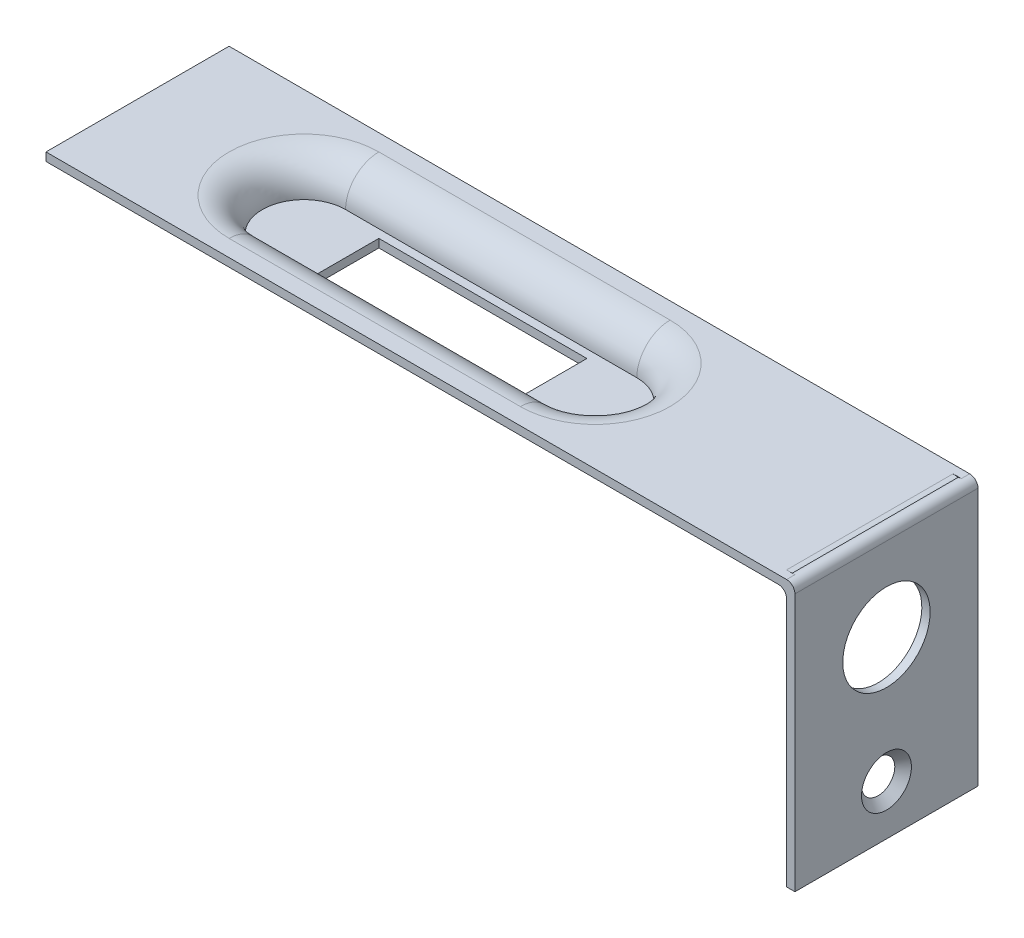
ISO-10303-21;
HEADER;
FILE_DESCRIPTION(('STEP AP214'),'2;1');
FILE_NAME('part.step','',(''),(''),'','','');
FILE_SCHEMA(('AUTOMOTIVE_DESIGN { 1 0 10303 214 1 1 1 1 }'));
ENDSEC;
DATA;
#1=APPLICATION_CONTEXT('core data for automotive mechanical design processes');
#2=APPLICATION_PROTOCOL_DEFINITION('international standard','automotive_design',2000,#1);
#3=PRODUCT_CONTEXT('',#1,'mechanical');
#4=PRODUCT('Part','Part','',(#3));
#5=PRODUCT_RELATED_PRODUCT_CATEGORY('part','',(#4));
#6=PRODUCT_DEFINITION_FORMATION('','',#4);
#7=PRODUCT_DEFINITION_CONTEXT('part definition',#1,'design');
#8=PRODUCT_DEFINITION('design','',#6,#7);
#9=PRODUCT_DEFINITION_SHAPE('','',#8);
#10=(LENGTH_UNIT() NAMED_UNIT(*) SI_UNIT(.MILLI.,.METRE.));
#11=(NAMED_UNIT(*) PLANE_ANGLE_UNIT() SI_UNIT($,.RADIAN.));
#12=(NAMED_UNIT(*) SI_UNIT($,.STERADIAN.) SOLID_ANGLE_UNIT());
#13=UNCERTAINTY_MEASURE_WITH_UNIT(LENGTH_MEASURE(1.E-05),#10,'distance_accuracy_value','');
#14=(GEOMETRIC_REPRESENTATION_CONTEXT(3) GLOBAL_UNCERTAINTY_ASSIGNED_CONTEXT((#13)) GLOBAL_UNIT_ASSIGNED_CONTEXT((#10,
#11,#12)) REPRESENTATION_CONTEXT('',''));
#15=CARTESIAN_POINT('',(0.,0.,0.));
#16=DIRECTION('',(0.,0.,1.));
#17=DIRECTION('',(1.,0.,0.));
#18=AXIS2_PLACEMENT_3D('',#15,#16,#17);
#19=CARTESIAN_POINT('',(-44.5,-1.00000000000001,-11.));
#20=DIRECTION('',(0.,-1.,0.));
#21=DIRECTION('',(1.,0.,0.));
#22=AXIS2_PLACEMENT_3D('',#19,#20,#21);
#23=PLANE('',#22);
#24=DIRECTION('',(-1.,0.,0.));
#25=VECTOR('',#24,1.);
#26=CARTESIAN_POINT('',(-44.5,-1.00000000000001,8.99999999999999));
#27=LINE('',#26,#25);
#28=CARTESIAN_POINT('',(-24.5,-1.00000000000001,9.));
#29=VERTEX_POINT('',#28);
#30=CARTESIAN_POINT('',(10.5,-1.00000000000001,9.));
#31=VERTEX_POINT('',#30);
#32=EDGE_CURVE('E434',#29,#31,#27,.F.);
#33=ORIENTED_EDGE('',*,*,#32,.T.);
#34=CARTESIAN_POINT('',(10.5,-1.00000000000001,0.));
#35=DIRECTION('',(0.,-1.,0.));
#36=DIRECTION('',(1.,0.,0.));
#37=AXIS2_PLACEMENT_3D('',#34,#35,#36);
#38=CIRCLE('',#37,9.);
#39=CARTESIAN_POINT('',(10.5,-1.00000000000001,-9.));
#40=VERTEX_POINT('',#39);
#41=EDGE_CURVE('E443',#31,#40,#38,.F.);
#42=ORIENTED_EDGE('',*,*,#41,.T.);
#43=DIRECTION('',(1.,0.,0.));
#44=VECTOR('',#43,1.);
#45=CARTESIAN_POINT('',(-44.5,-1.00000000000001,-9.00000000000001));
#46=LINE('',#45,#44);
#47=CARTESIAN_POINT('',(-24.5,-1.00000000000001,-9.00000000000001));
#48=VERTEX_POINT('',#47);
#49=EDGE_CURVE('E440',#40,#48,#46,.F.);
#50=ORIENTED_EDGE('',*,*,#49,.T.);
#51=CARTESIAN_POINT('',(-24.5,-1.00000000000001,0.));
#52=DIRECTION('',(0.,-1.,0.));
#53=DIRECTION('',(1.,0.,0.));
#54=AXIS2_PLACEMENT_3D('',#51,#52,#53);
#55=CIRCLE('',#54,9.);
#56=EDGE_CURVE('E437',#48,#29,#55,.F.);
#57=ORIENTED_EDGE('',*,*,#56,.T.);
#58=EDGE_LOOP('',(#33,#42,#50,#57));
#59=FACE_BOUND('',#58,.T.);
#60=DIRECTION('',(0.,0.,1.));
#61=VECTOR('',#60,1.);
#62=CARTESIAN_POINT('',(43.5,-1.00000000000001,-11.));
#63=LINE('',#62,#61);
#64=CARTESIAN_POINT('',(43.5,-1.00000000000001,-11.));
#65=VERTEX_POINT('',#64);
#66=CARTESIAN_POINT('',(43.5,-1.00000000000001,11.));
#67=VERTEX_POINT('',#66);
#68=EDGE_CURVE('E423',#65,#67,#63,.T.);
#69=ORIENTED_EDGE('',*,*,#68,.T.);
#70=DIRECTION('',(1.,0.,0.));
#71=VECTOR('',#70,1.);
#72=CARTESIAN_POINT('',(-44.5,-1.00000000000001,11.));
#73=LINE('',#72,#71);
#74=CARTESIAN_POINT('',(-44.5,-1.00000000000001,11.));
#75=VERTEX_POINT('',#74);
#76=EDGE_CURVE('E348',#75,#67,#73,.T.);
#77=ORIENTED_EDGE('',*,*,#76,.F.);
#78=DIRECTION('',(0.,0.,1.));
#79=VECTOR('',#78,1.);
#80=CARTESIAN_POINT('',(-44.5,-1.00000000000001,-11.));
#81=LINE('',#80,#79);
#82=CARTESIAN_POINT('',(-44.5,-1.00000000000001,-11.));
#83=VERTEX_POINT('',#82);
#84=EDGE_CURVE('E426',#83,#75,#81,.T.);
#85=ORIENTED_EDGE('',*,*,#84,.F.);
#86=DIRECTION('',(1.,0.,0.));
#87=VECTOR('',#86,1.);
#88=CARTESIAN_POINT('',(-44.5,-1.00000000000001,-11.));
#89=LINE('',#88,#87);
#90=EDGE_CURVE('E380',#83,#65,#89,.T.);
#91=ORIENTED_EDGE('',*,*,#90,.T.);
#92=EDGE_LOOP('',(#69,#77,#85,#91));
#93=FACE_BOUND('',#92,.T.);
#94=ADVANCED_FACE('F47',(#59,#93),#23,.T.);
#95=CARTESIAN_POINT('',(44.5,0.,-11.));
#96=DIRECTION('',(0.,1.,0.));
#97=DIRECTION('',(-1.,0.,0.));
#98=AXIS2_PLACEMENT_3D('',#95,#96,#97);
#99=PLANE('',#98);
#100=DIRECTION('',(-1.,0.,0.));
#101=VECTOR('',#100,1.);
#102=CARTESIAN_POINT('',(43.5,0.,-10.));
#103=LINE('',#102,#101);
#104=CARTESIAN_POINT('',(44.5,0.,-10.));
#105=VERTEX_POINT('',#104);
#106=CARTESIAN_POINT('',(43.5,0.,-10.));
#107=VERTEX_POINT('',#106);
#108=EDGE_CURVE('E288',#105,#107,#103,.T.);
#109=ORIENTED_EDGE('',*,*,#108,.F.);
#110=DIRECTION('',(0.,0.,1.));
#111=VECTOR('',#110,1.);
#112=CARTESIAN_POINT('',(44.5,0.,-11.));
#113=LINE('',#112,#111);
#114=CARTESIAN_POINT('',(44.5,0.,-11.));
#115=VERTEX_POINT('',#114);
#116=EDGE_CURVE('E405',#115,#105,#113,.T.);
#117=ORIENTED_EDGE('',*,*,#116,.F.);
#118=DIRECTION('',(-1.,0.,0.));
#119=VECTOR('',#118,1.);
#120=CARTESIAN_POINT('',(44.5,0.,-11.));
#121=LINE('',#120,#119);
#122=CARTESIAN_POINT('',(-44.5,0.,-11.));
#123=VERTEX_POINT('',#122);
#124=EDGE_CURVE('E372',#115,#123,#121,.T.);
#125=ORIENTED_EDGE('',*,*,#124,.T.);
#126=DIRECTION('',(0.,0.,1.));
#127=VECTOR('',#126,1.);
#128=CARTESIAN_POINT('',(-44.5,0.,-11.));
#129=LINE('',#128,#127);
#130=CARTESIAN_POINT('',(-44.5,0.,11.));
#131=VERTEX_POINT('',#130);
#132=EDGE_CURVE('E404',#123,#131,#129,.T.);
#133=ORIENTED_EDGE('',*,*,#132,.T.);
#134=DIRECTION('',(-1.,0.,0.));
#135=VECTOR('',#134,1.);
#136=CARTESIAN_POINT('',(44.5,0.,11.));
#137=LINE('',#136,#135);
#138=CARTESIAN_POINT('',(44.5,0.,11.));
#139=VERTEX_POINT('',#138);
#140=EDGE_CURVE('E331',#139,#131,#137,.T.);
#141=ORIENTED_EDGE('',*,*,#140,.F.);
#142=CARTESIAN_POINT('',(44.5,0.,10.));
#143=VERTEX_POINT('',#142);
#144=EDGE_CURVE('E410',#143,#139,#113,.T.);
#145=ORIENTED_EDGE('',*,*,#144,.F.);
#146=DIRECTION('',(-1.,0.,0.));
#147=VECTOR('',#146,1.);
#148=CARTESIAN_POINT('',(43.5,0.,10.));
#149=LINE('',#148,#147);
#150=CARTESIAN_POINT('',(43.5,0.,10.));
#151=VERTEX_POINT('',#150);
#152=EDGE_CURVE('E289',#143,#151,#149,.T.);
#153=ORIENTED_EDGE('',*,*,#152,.T.);
#154=DIRECTION('',(0.,0.,1.));
#155=VECTOR('',#154,1.);
#156=CARTESIAN_POINT('',(43.5,0.,-11.));
#157=LINE('',#156,#155);
#158=EDGE_CURVE('E281',#107,#151,#157,.T.);
#159=ORIENTED_EDGE('',*,*,#158,.F.);
#160=EDGE_LOOP('',(#109,#117,#125,#133,#141,#145,#153,#159));
#161=FACE_BOUND('',#160,.T.);
#162=DIRECTION('',(1.,0.,0.));
#163=VECTOR('',#162,1.);
#164=CARTESIAN_POINT('',(-44.5,0.,-9.));
#165=LINE('',#164,#163);
#166=CARTESIAN_POINT('',(10.5,0.,-9.));
#167=VERTEX_POINT('',#166);
#168=CARTESIAN_POINT('',(-24.5,0.,-9.00000000000001));
#169=VERTEX_POINT('',#168);
#170=EDGE_CURVE('E276',#167,#169,#165,.F.);
#171=ORIENTED_EDGE('',*,*,#170,.F.);
#172=CARTESIAN_POINT('',(10.5,0.,0.));
#173=DIRECTION('',(0.,-1.,0.));
#174=DIRECTION('',(1.,0.,0.));
#175=AXIS2_PLACEMENT_3D('',#172,#173,#174);
#176=CIRCLE('',#175,9.);
#177=CARTESIAN_POINT('',(10.5,0.,9.));
#178=VERTEX_POINT('',#177);
#179=EDGE_CURVE('E272',#178,#167,#176,.F.);
#180=ORIENTED_EDGE('',*,*,#179,.F.);
#181=DIRECTION('',(1.,0.,0.));
#182=VECTOR('',#181,1.);
#183=CARTESIAN_POINT('',(-44.5,0.,9.));
#184=LINE('',#183,#182);
#185=CARTESIAN_POINT('',(-24.5,0.,9.));
#186=VERTEX_POINT('',#185);
#187=EDGE_CURVE('E266',#186,#178,#184,.T.);
#188=ORIENTED_EDGE('',*,*,#187,.F.);
#189=CARTESIAN_POINT('',(-24.5,0.,0.));
#190=DIRECTION('',(0.,-1.,0.));
#191=DIRECTION('',(1.,0.,0.));
#192=AXIS2_PLACEMENT_3D('',#189,#190,#191);
#193=CIRCLE('',#192,9.00000000000001);
#194=EDGE_CURVE('E270',#169,#186,#193,.F.);
#195=ORIENTED_EDGE('',*,*,#194,.F.);
#196=EDGE_LOOP('',(#171,#180,#188,#195));
#197=FACE_BOUND('',#196,.T.);
#198=ADVANCED_FACE('F514',(#161,#197),#99,.T.);
#199=CARTESIAN_POINT('',(44.5,-0.999999999999995,-11.));
#200=DIRECTION('',(0.,0.,1.));
#201=DIRECTION('',(1.,0.,0.));
#202=AXIS2_PLACEMENT_3D('',#199,#200,#201);
#203=CYLINDRICAL_SURFACE('',#202,1.);
#204=ORIENTED_EDGE('',*,*,#116,.T.);
#205=CARTESIAN_POINT('',(44.5,-0.999999999999995,-10.));
#206=DIRECTION('',(0.,0.,1.));
#207=DIRECTION('',(1.,0.,0.));
#208=AXIS2_PLACEMENT_3D('',#205,#206,#207);
#209=CIRCLE('',#208,1.);
#210=CARTESIAN_POINT('',(44.0885621722338,-0.088562172233853,-10.));
#211=VERTEX_POINT('',#210);
#212=EDGE_CURVE('E502',#105,#211,#209,.T.);
#213=ORIENTED_EDGE('',*,*,#212,.T.);
#214=DIRECTION('',(0.,0.,-1.));
#215=VECTOR('',#214,1.);
#216=CARTESIAN_POINT('',(44.0885621722338,-0.0885621722338535,-11.));
#217=LINE('',#216,#215);
#218=CARTESIAN_POINT('',(44.0885621722338,-0.0885621722338538,10.));
#219=VERTEX_POINT('',#218);
#220=EDGE_CURVE('E11',#219,#211,#217,.T.);
#221=ORIENTED_EDGE('',*,*,#220,.F.);
#222=CARTESIAN_POINT('',(44.5,-0.999999999999995,10.));
#223=DIRECTION('',(0.,0.,1.));
#224=DIRECTION('',(1.,0.,0.));
#225=AXIS2_PLACEMENT_3D('',#222,#223,#224);
#226=CIRCLE('',#225,1.);
#227=EDGE_CURVE('E57',#143,#219,#226,.T.);
#228=ORIENTED_EDGE('',*,*,#227,.F.);
#229=ORIENTED_EDGE('',*,*,#144,.T.);
#230=CARTESIAN_POINT('',(44.5,-0.999999999999995,11.));
#231=DIRECTION('',(0.,0.,1.));
#232=DIRECTION('',(-1.,0.,0.));
#233=AXIS2_PLACEMENT_3D('',#230,#231,#232);
#234=CIRCLE('',#233,1.);
#235=CARTESIAN_POINT('',(45.5,-0.999999999999994,11.));
#236=VERTEX_POINT('',#235);
#237=EDGE_CURVE('E368',#236,#139,#234,.T.);
#238=ORIENTED_EDGE('',*,*,#237,.F.);
#239=DIRECTION('',(0.,0.,1.));
#240=VECTOR('',#239,1.);
#241=CARTESIAN_POINT('',(45.5,-0.999999999999994,-11.));
#242=LINE('',#241,#240);
#243=CARTESIAN_POINT('',(45.5,-0.999999999999994,-11.));
#244=VERTEX_POINT('',#243);
#245=EDGE_CURVE('E411',#244,#236,#242,.T.);
#246=ORIENTED_EDGE('',*,*,#245,.F.);
#247=CARTESIAN_POINT('',(44.5,-0.999999999999995,-11.));
#248=DIRECTION('',(0.,0.,1.));
#249=DIRECTION('',(-1.,0.,0.));
#250=AXIS2_PLACEMENT_3D('',#247,#248,#249);
#251=CIRCLE('',#250,1.);
#252=EDGE_CURVE('E400',#244,#115,#251,.T.);
#253=ORIENTED_EDGE('',*,*,#252,.T.);
#254=EDGE_LOOP('',(#204,#213,#221,#228,#229,#238,#246,#253));
#255=FACE_BOUND('',#254,.T.);
#256=ADVANCED_FACE('F519',(#255),#203,.T.);
#257=CARTESIAN_POINT('',(45.5,-32.,-11.));
#258=DIRECTION('',(1.,0.,0.));
#259=DIRECTION('',(0.,1.,0.));
#260=AXIS2_PLACEMENT_3D('',#257,#258,#259);
#261=PLANE('',#260);
#262=CARTESIAN_POINT('',(45.5,-26.,0.));
#263=DIRECTION('',(1.,0.,0.));
#264=DIRECTION('',(0.,1.,0.));
#265=AXIS2_PLACEMENT_3D('',#262,#263,#264);
#266=CIRCLE('',#265,3.00000000000009);
#267=CARTESIAN_POINT('',(45.5,-22.9999999999999,0.));
#268=VERTEX_POINT('',#267);
#269=EDGE_CURVE('E486',#268,#268,#266,.F.);
#270=ORIENTED_EDGE('',*,*,#269,.T.);
#271=EDGE_LOOP('',(#270));
#272=FACE_BOUND('',#271,.T.);
#273=CARTESIAN_POINT('',(45.5,-11.,0.));
#274=DIRECTION('',(1.,0.,0.));
#275=DIRECTION('',(0.,1.,0.));
#276=AXIS2_PLACEMENT_3D('',#273,#274,#275);
#277=CIRCLE('',#276,5.25);
#278=CARTESIAN_POINT('',(45.5,-5.74999999999999,0.));
#279=VERTEX_POINT('',#278);
#280=EDGE_CURVE('E327',#279,#279,#277,.T.);
#281=ORIENTED_EDGE('',*,*,#280,.F.);
#282=EDGE_LOOP('',(#281));
#283=FACE_BOUND('',#282,.T.);
#284=ORIENTED_EDGE('',*,*,#245,.T.);
#285=DIRECTION('',(0.,1.,0.));
#286=VECTOR('',#285,1.);
#287=CARTESIAN_POINT('',(45.5,-32.,11.));
#288=LINE('',#287,#286);
#289=CARTESIAN_POINT('',(45.5,-32.,11.));
#290=VERTEX_POINT('',#289);
#291=EDGE_CURVE('E364',#290,#236,#288,.T.);
#292=ORIENTED_EDGE('',*,*,#291,.F.);
#293=DIRECTION('',(0.,0.,1.));
#294=VECTOR('',#293,1.);
#295=CARTESIAN_POINT('',(45.5,-32.,-11.));
#296=LINE('',#295,#294);
#297=CARTESIAN_POINT('',(45.5,-32.,-11.));
#298=VERTEX_POINT('',#297);
#299=EDGE_CURVE('E414',#298,#290,#296,.T.);
#300=ORIENTED_EDGE('',*,*,#299,.F.);
#301=DIRECTION('',(0.,1.,0.));
#302=VECTOR('',#301,1.);
#303=CARTESIAN_POINT('',(45.5,-32.,-11.));
#304=LINE('',#303,#302);
#305=EDGE_CURVE('E396',#298,#244,#304,.T.);
#306=ORIENTED_EDGE('',*,*,#305,.T.);
#307=EDGE_LOOP('',(#284,#292,#300,#306));
#308=FACE_BOUND('',#307,.T.);
#309=ADVANCED_FACE('F525',(#272,#283,#308),#261,.T.);
#310=CARTESIAN_POINT('',(44.5,-32.,-11.));
#311=DIRECTION('',(0.,-1.,0.));
#312=DIRECTION('',(0.,0.,-1.));
#313=AXIS2_PLACEMENT_3D('',#310,#311,#312);
#314=PLANE('',#313);
#315=ORIENTED_EDGE('',*,*,#299,.T.);
#316=DIRECTION('',(1.,0.,0.));
#317=VECTOR('',#316,1.);
#318=CARTESIAN_POINT('',(44.5,-32.,11.));
#319=LINE('',#318,#317);
#320=CARTESIAN_POINT('',(44.5,-32.,11.));
#321=VERTEX_POINT('',#320);
#322=EDGE_CURVE('E360',#321,#290,#319,.T.);
#323=ORIENTED_EDGE('',*,*,#322,.F.);
#324=DIRECTION('',(0.,0.,1.));
#325=VECTOR('',#324,1.);
#326=CARTESIAN_POINT('',(44.5,-32.,-11.));
#327=LINE('',#326,#325);
#328=CARTESIAN_POINT('',(44.5,-32.,-11.));
#329=VERTEX_POINT('',#328);
#330=EDGE_CURVE('E417',#329,#321,#327,.T.);
#331=ORIENTED_EDGE('',*,*,#330,.F.);
#332=DIRECTION('',(1.,0.,0.));
#333=VECTOR('',#332,1.);
#334=CARTESIAN_POINT('',(44.5,-32.,-11.));
#335=LINE('',#334,#333);
#336=EDGE_CURVE('E392',#329,#298,#335,.T.);
#337=ORIENTED_EDGE('',*,*,#336,.T.);
#338=EDGE_LOOP('',(#315,#323,#331,#337));
#339=FACE_BOUND('',#338,.T.);
#340=ADVANCED_FACE('F548',(#339),#314,.T.);
#341=CARTESIAN_POINT('',(44.5,-2.00000000000001,-11.));
#342=DIRECTION('',(-1.,0.,0.));
#343=DIRECTION('',(0.,-1.,0.));
#344=AXIS2_PLACEMENT_3D('',#341,#342,#343);
#345=PLANE('',#344);
#346=CARTESIAN_POINT('',(44.5,-11.,0.));
#347=DIRECTION('',(-1.,0.,0.));
#348=DIRECTION('',(0.,-1.,0.));
#349=AXIS2_PLACEMENT_3D('',#346,#347,#348);
#350=CIRCLE('',#349,5.25);
#351=CARTESIAN_POINT('',(44.5,-5.74999999999999,0.));
#352=VERTEX_POINT('',#351);
#353=EDGE_CURVE('E332',#352,#352,#350,.F.);
#354=ORIENTED_EDGE('',*,*,#353,.T.);
#355=EDGE_LOOP('',(#354));
#356=FACE_BOUND('',#355,.T.);
#357=CARTESIAN_POINT('',(44.5,-26.,0.));
#358=DIRECTION('',(-1.,0.,0.));
#359=DIRECTION('',(0.,-1.,0.));
#360=AXIS2_PLACEMENT_3D('',#357,#358,#359);
#361=CIRCLE('',#360,2.);
#362=CARTESIAN_POINT('',(44.5,-28.,0.));
#363=VERTEX_POINT('',#362);
#364=EDGE_CURVE('E336',#363,#363,#361,.F.);
#365=ORIENTED_EDGE('',*,*,#364,.T.);
#366=EDGE_LOOP('',(#365));
#367=FACE_BOUND('',#366,.T.);
#368=ORIENTED_EDGE('',*,*,#330,.T.);
#369=DIRECTION('',(0.,-1.,0.));
#370=VECTOR('',#369,1.);
#371=CARTESIAN_POINT('',(44.5,-2.00000000000001,11.));
#372=LINE('',#371,#370);
#373=CARTESIAN_POINT('',(44.5,-2.00000000000001,11.));
#374=VERTEX_POINT('',#373);
#375=EDGE_CURVE('E356',#374,#321,#372,.T.);
#376=ORIENTED_EDGE('',*,*,#375,.F.);
#377=DIRECTION('',(0.,0.,1.));
#378=VECTOR('',#377,1.);
#379=CARTESIAN_POINT('',(44.5,-2.00000000000001,-11.));
#380=LINE('',#379,#378);
#381=CARTESIAN_POINT('',(44.5,-2.00000000000001,-11.));
#382=VERTEX_POINT('',#381);
#383=EDGE_CURVE('E420',#382,#374,#380,.T.);
#384=ORIENTED_EDGE('',*,*,#383,.F.);
#385=DIRECTION('',(0.,-1.,0.));
#386=VECTOR('',#385,1.);
#387=CARTESIAN_POINT('',(44.5,-2.00000000000001,-11.));
#388=LINE('',#387,#386);
#389=EDGE_CURVE('E388',#382,#329,#388,.T.);
#390=ORIENTED_EDGE('',*,*,#389,.T.);
#391=EDGE_LOOP('',(#368,#376,#384,#390));
#392=FACE_BOUND('',#391,.T.);
#393=ADVANCED_FACE('F545',(#356,#367,#392),#345,.T.);
#394=CARTESIAN_POINT('',(43.5,-2.00000000000001,-11.));
#395=DIRECTION('',(0.,0.,1.));
#396=DIRECTION('',(1.,0.,0.));
#397=AXIS2_PLACEMENT_3D('',#394,#395,#396);
#398=CYLINDRICAL_SURFACE('',#397,1.);
#399=ORIENTED_EDGE('',*,*,#383,.T.);
#400=CARTESIAN_POINT('',(43.5,-2.00000000000001,11.));
#401=DIRECTION('',(0.,0.,-1.));
#402=DIRECTION('',(1.,0.,0.));
#403=AXIS2_PLACEMENT_3D('',#400,#401,#402);
#404=CIRCLE('',#403,1.);
#405=EDGE_CURVE('E352',#67,#374,#404,.T.);
#406=ORIENTED_EDGE('',*,*,#405,.F.);
#407=ORIENTED_EDGE('',*,*,#68,.F.);
#408=CARTESIAN_POINT('',(43.5,-2.00000000000001,-11.));
#409=DIRECTION('',(0.,0.,-1.));
#410=DIRECTION('',(1.,0.,0.));
#411=AXIS2_PLACEMENT_3D('',#408,#409,#410);
#412=CIRCLE('',#411,1.);
#413=EDGE_CURVE('E384',#65,#382,#412,.T.);
#414=ORIENTED_EDGE('',*,*,#413,.T.);
#415=EDGE_LOOP('',(#399,#406,#407,#414));
#416=FACE_BOUND('',#415,.T.);
#417=ADVANCED_FACE('F542',(#416),#398,.F.);
#418=CARTESIAN_POINT('',(-44.5,0.,-11.));
#419=DIRECTION('',(-1.,0.,0.));
#420=DIRECTION('',(0.,0.,1.));
#421=AXIS2_PLACEMENT_3D('',#418,#419,#420);
#422=PLANE('',#421);
#423=ORIENTED_EDGE('',*,*,#84,.T.);
#424=DIRECTION('',(0.,-1.,0.));
#425=VECTOR('',#424,1.);
#426=CARTESIAN_POINT('',(-44.5,0.,11.));
#427=LINE('',#426,#425);
#428=EDGE_CURVE('E344',#131,#75,#427,.T.);
#429=ORIENTED_EDGE('',*,*,#428,.F.);
#430=ORIENTED_EDGE('',*,*,#132,.F.);
#431=DIRECTION('',(0.,-1.,0.));
#432=VECTOR('',#431,1.);
#433=CARTESIAN_POINT('',(-44.5,0.,-11.));
#434=LINE('',#433,#432);
#435=EDGE_CURVE('E376',#123,#83,#434,.T.);
#436=ORIENTED_EDGE('',*,*,#435,.T.);
#437=EDGE_LOOP('',(#423,#429,#430,#436));
#438=FACE_BOUND('',#437,.T.);
#439=ADVANCED_FACE('F536',(#438),#422,.T.);
#440=CARTESIAN_POINT('',(43.5,-2.00000000000001,-11.));
#441=DIRECTION('',(0.,0.,1.));
#442=DIRECTION('',(1.,0.,0.));
#443=AXIS2_PLACEMENT_3D('',#440,#441,#442);
#444=PLANE('',#443);
#445=ORIENTED_EDGE('',*,*,#124,.F.);
#446=ORIENTED_EDGE('',*,*,#252,.F.);
#447=ORIENTED_EDGE('',*,*,#305,.F.);
#448=ORIENTED_EDGE('',*,*,#336,.F.);
#449=ORIENTED_EDGE('',*,*,#389,.F.);
#450=ORIENTED_EDGE('',*,*,#413,.F.);
#451=ORIENTED_EDGE('',*,*,#90,.F.);
#452=ORIENTED_EDGE('',*,*,#435,.F.);
#453=EDGE_LOOP('',(#445,#446,#447,#448,#449,#450,#451,#452));
#454=FACE_BOUND('',#453,.T.);
#455=ADVANCED_FACE('F530',(#454),#444,.F.);
#456=CARTESIAN_POINT('',(43.5,-2.00000000000001,11.));
#457=DIRECTION('',(0.,0.,1.));
#458=DIRECTION('',(1.,0.,0.));
#459=AXIS2_PLACEMENT_3D('',#456,#457,#458);
#460=PLANE('',#459);
#461=ORIENTED_EDGE('',*,*,#140,.T.);
#462=ORIENTED_EDGE('',*,*,#428,.T.);
#463=ORIENTED_EDGE('',*,*,#76,.T.);
#464=ORIENTED_EDGE('',*,*,#405,.T.);
#465=ORIENTED_EDGE('',*,*,#375,.T.);
#466=ORIENTED_EDGE('',*,*,#322,.T.);
#467=ORIENTED_EDGE('',*,*,#291,.T.);
#468=ORIENTED_EDGE('',*,*,#237,.T.);
#469=EDGE_LOOP('',(#461,#462,#463,#464,#465,#466,#467,#468));
#470=FACE_BOUND('',#469,.T.);
#471=ADVANCED_FACE('F521',(#470),#460,.T.);
#472=CARTESIAN_POINT('',(-44.501,-11.,0.));
#473=DIRECTION('',(1.,0.,0.));
#474=DIRECTION('',(0.,1.,0.));
#475=AXIS2_PLACEMENT_3D('',#472,#473,#474);
#476=CYLINDRICAL_SURFACE('',#475,5.25);
#477=CARTESIAN_POINT('',(44.5,-5.74999999999999,0.));
#478=CARTESIAN_POINT('',(44.5104166666667,-5.74999999999999,0.));
#479=CARTESIAN_POINT('',(44.5208333333333,-5.74999999999999,0.));
#480=CARTESIAN_POINT('',(44.5416666666667,-5.74999999999999,0.));
#481=CARTESIAN_POINT('',(44.5520833333333,-5.74999999999999,0.));
#482=CARTESIAN_POINT('',(44.5729166666667,-5.74999999999999,0.));
#483=CARTESIAN_POINT('',(44.5833333333333,-5.74999999999999,0.));
#484=CARTESIAN_POINT('',(44.6041666666667,-5.74999999999999,0.));
#485=CARTESIAN_POINT('',(44.6145833333333,-5.74999999999999,0.));
#486=CARTESIAN_POINT('',(44.6354166666667,-5.74999999999999,0.));
#487=CARTESIAN_POINT('',(44.6458333333333,-5.74999999999999,0.));
#488=CARTESIAN_POINT('',(44.6666666666667,-5.74999999999999,0.));
#489=CARTESIAN_POINT('',(44.6770833333333,-5.74999999999999,0.));
#490=CARTESIAN_POINT('',(44.6979166666667,-5.74999999999999,0.));
#491=CARTESIAN_POINT('',(44.7083333333333,-5.74999999999999,0.));
#492=CARTESIAN_POINT('',(44.7291666666667,-5.74999999999999,0.));
#493=CARTESIAN_POINT('',(44.7395833333333,-5.74999999999999,0.));
#494=CARTESIAN_POINT('',(44.7604166666667,-5.74999999999999,0.));
#495=CARTESIAN_POINT('',(44.7708333333333,-5.74999999999999,0.));
#496=CARTESIAN_POINT('',(44.7916666666667,-5.74999999999999,0.));
#497=CARTESIAN_POINT('',(44.8020833333333,-5.74999999999999,0.));
#498=CARTESIAN_POINT('',(44.8229166666667,-5.74999999999999,0.));
#499=CARTESIAN_POINT('',(44.8333333333333,-5.74999999999999,0.));
#500=CARTESIAN_POINT('',(44.8541666666667,-5.74999999999999,0.));
#501=CARTESIAN_POINT('',(44.8645833333333,-5.74999999999999,0.));
#502=CARTESIAN_POINT('',(44.8854166666667,-5.74999999999999,0.));
#503=CARTESIAN_POINT('',(44.8958333333333,-5.74999999999999,0.));
#504=CARTESIAN_POINT('',(44.9166666666667,-5.74999999999999,0.));
#505=CARTESIAN_POINT('',(44.9270833333333,-5.74999999999999,0.));
#506=CARTESIAN_POINT('',(44.9479166666667,-5.74999999999999,0.));
#507=CARTESIAN_POINT('',(44.9583333333333,-5.74999999999999,0.));
#508=CARTESIAN_POINT('',(44.9791666666667,-5.74999999999999,0.));
#509=CARTESIAN_POINT('',(44.9895833333333,-5.74999999999999,0.));
#510=CARTESIAN_POINT('',(45.0104166666667,-5.74999999999999,0.));
#511=CARTESIAN_POINT('',(45.0208333333333,-5.74999999999999,0.));
#512=CARTESIAN_POINT('',(45.0416666666667,-5.74999999999999,0.));
#513=CARTESIAN_POINT('',(45.0520833333333,-5.74999999999999,0.));
#514=CARTESIAN_POINT('',(45.0729166666667,-5.74999999999999,0.));
#515=CARTESIAN_POINT('',(45.0833333333333,-5.74999999999999,0.));
#516=CARTESIAN_POINT('',(45.1041666666667,-5.74999999999999,0.));
#517=CARTESIAN_POINT('',(45.1145833333333,-5.74999999999999,0.));
#518=CARTESIAN_POINT('',(45.1354166666667,-5.74999999999999,0.));
#519=CARTESIAN_POINT('',(45.1458333333333,-5.74999999999999,0.));
#520=CARTESIAN_POINT('',(45.1666666666667,-5.74999999999999,0.));
#521=CARTESIAN_POINT('',(45.1770833333333,-5.74999999999999,0.));
#522=CARTESIAN_POINT('',(45.1979166666667,-5.74999999999999,0.));
#523=CARTESIAN_POINT('',(45.2083333333333,-5.74999999999999,0.));
#524=CARTESIAN_POINT('',(45.2291666666667,-5.74999999999999,0.));
#525=CARTESIAN_POINT('',(45.2395833333333,-5.74999999999999,0.));
#526=CARTESIAN_POINT('',(45.2604166666667,-5.74999999999999,0.));
#527=CARTESIAN_POINT('',(45.2708333333333,-5.74999999999999,0.));
#528=CARTESIAN_POINT('',(45.2916666666667,-5.74999999999999,0.));
#529=CARTESIAN_POINT('',(45.3020833333333,-5.74999999999999,0.));
#530=CARTESIAN_POINT('',(45.3229166666667,-5.74999999999999,0.));
#531=CARTESIAN_POINT('',(45.3333333333333,-5.74999999999999,0.));
#532=CARTESIAN_POINT('',(45.3541666666667,-5.74999999999999,0.));
#533=CARTESIAN_POINT('',(45.3645833333333,-5.74999999999999,0.));
#534=CARTESIAN_POINT('',(45.3854166666667,-5.74999999999999,0.));
#535=CARTESIAN_POINT('',(45.3958333333333,-5.74999999999999,0.));
#536=CARTESIAN_POINT('',(45.4166666666667,-5.74999999999999,0.));
#537=CARTESIAN_POINT('',(45.4270833333333,-5.74999999999999,0.));
#538=CARTESIAN_POINT('',(45.4479166666667,-5.74999999999999,0.));
#539=CARTESIAN_POINT('',(45.4583333333333,-5.74999999999999,0.));
#540=CARTESIAN_POINT('',(45.4791666666667,-5.74999999999999,0.));
#541=CARTESIAN_POINT('',(45.4895833333333,-5.74999999999999,0.));
#542=CARTESIAN_POINT('',(45.5,-5.74999999999999,0.));
#543=B_SPLINE_CURVE_WITH_KNOTS('',3,(#477,#478,#479,#480,#481,#482,#483,#484,#485,#486,#487,
#488,#489,#490,#491,#492,#493,#494,#495,#496,#497,#498,#499,#500,#501,#502,#503,#504,#505,#506,
#507,#508,#509,#510,#511,#512,#513,#514,#515,#516,#517,#518,#519,#520,#521,#522,#523,#524,#525,
#526,#527,#528,#529,#530,#531,#532,#533,#534,#535,#536,#537,#538,#539,#540,#541,#542),
.UNSPECIFIED.,.F.,.F.,(4,2,2,2,2,2,2,2,2,2,2,2,2,2,2,2,2,2,2,2,2,2,2,2,2,2,2,2,2,2,2,2,4),(0.,
0.0312499999999966,0.0624999999999931,0.0937500000000036,0.125,0.156249999999997,
0.187500000000007,0.218750000000004,0.25,0.281249999999997,0.312499999999993,0.343750000000004,
0.375,0.406249999999997,0.437500000000007,0.468750000000004,0.5,0.531249999999997,
0.562499999999994,0.593750000000004,0.625000000000001,0.656249999999997,0.687500000000008,
0.718750000000004,0.750000000000001,0.781249999999997,0.812499999999994,0.843750000000004,
0.875000000000001,0.906249999999997,0.937500000000008,0.968750000000004,1.),.UNSPECIFIED.);
#544=EDGE_CURVE('BSEAM624',#352,#279,#543,.T.);
#545=ORIENTED_EDGE('',*,*,#353,.F.);
#546=ORIENTED_EDGE('',*,*,#280,.T.);
#547=ORIENTED_EDGE('',*,*,#544,.T.);
#548=ORIENTED_EDGE('',*,*,#544,.F.);
#549=EDGE_LOOP('',(#545,#547,#546,#548));
#550=FACE_BOUND('',#549,.T.);
#551=ADVANCED_FACE('F624',(#550),#476,.F.);
#552=CARTESIAN_POINT('',(10.5,-5.00000000000001,0.));
#553=DIRECTION('',(0.,-1.,0.));
#554=DIRECTION('',(1.,0.,0.));
#555=AXIS2_PLACEMENT_3D('',#552,#553,#554);
#556=PLANE('',#555);
#557=DIRECTION('',(0.,0.,-1.));
#558=VECTOR('',#557,1.);
#559=CARTESIAN_POINT('',(5.50000000000001,-5.,-4.00000000000001));
#560=LINE('',#559,#558);
#561=CARTESIAN_POINT('',(5.5,-5.,4.00000000000001));
#562=VERTEX_POINT('',#561);
#563=CARTESIAN_POINT('',(5.50000000000001,-5.,-4.00000000000001));
#564=VERTEX_POINT('',#563);
#565=EDGE_CURVE('E229',#562,#564,#560,.T.);
#566=ORIENTED_EDGE('',*,*,#565,.T.);
#567=DIRECTION('',(-1.,0.,0.));
#568=VECTOR('',#567,1.);
#569=CARTESIAN_POINT('',(-19.5,-5.,-4.00000000000001));
#570=LINE('',#569,#568);
#571=CARTESIAN_POINT('',(-19.5,-5.00000000000001,-4.00000000000001));
#572=VERTEX_POINT('',#571);
#573=EDGE_CURVE('E212',#564,#572,#570,.T.);
#574=ORIENTED_EDGE('',*,*,#573,.T.);
#575=DIRECTION('',(0.,0.,1.));
#576=VECTOR('',#575,1.);
#577=CARTESIAN_POINT('',(-19.5,-5.,-4.00000000000001));
#578=LINE('',#577,#576);
#579=CARTESIAN_POINT('',(-19.5,-5.,4.00000000000001));
#580=VERTEX_POINT('',#579);
#581=EDGE_CURVE('E246',#572,#580,#578,.T.);
#582=ORIENTED_EDGE('',*,*,#581,.T.);
#583=DIRECTION('',(1.,0.,0.));
#584=VECTOR('',#583,1.);
#585=CARTESIAN_POINT('',(-19.5,-5.,4.00000000000001));
#586=LINE('',#585,#584);
#587=EDGE_CURVE('E239',#580,#562,#586,.T.);
#588=ORIENTED_EDGE('',*,*,#587,.T.);
#589=EDGE_LOOP('',(#566,#574,#582,#588));
#590=FACE_BOUND('',#589,.T.);
#591=DIRECTION('',(1.,0.,0.));
#592=VECTOR('',#591,1.);
#593=CARTESIAN_POINT('',(10.5,-5.00000000000001,-5.));
#594=LINE('',#593,#592);
#595=CARTESIAN_POINT('',(-24.5,-5.00000000000001,-5.00000000000001));
#596=VERTEX_POINT('',#595);
#597=CARTESIAN_POINT('',(10.5,-5.00000000000001,-5.));
#598=VERTEX_POINT('',#597);
#599=EDGE_CURVE('E479',#596,#598,#594,.T.);
#600=ORIENTED_EDGE('',*,*,#599,.T.);
#601=CARTESIAN_POINT('',(10.5,-5.00000000000001,0.));
#602=DIRECTION('',(0.,-1.,0.));
#603=DIRECTION('',(1.,0.,0.));
#604=AXIS2_PLACEMENT_3D('',#601,#602,#603);
#605=CIRCLE('',#604,5.);
#606=CARTESIAN_POINT('',(10.5,-5.00000000000001,5.));
#607=VERTEX_POINT('',#606);
#608=EDGE_CURVE('E482',#598,#607,#605,.T.);
#609=ORIENTED_EDGE('',*,*,#608,.T.);
#610=DIRECTION('',(-1.,0.,0.));
#611=VECTOR('',#610,1.);
#612=CARTESIAN_POINT('',(-24.5,-5.00000000000001,5.));
#613=LINE('',#612,#611);
#614=CARTESIAN_POINT('',(-24.5,-5.00000000000001,5.));
#615=VERTEX_POINT('',#614);
#616=EDGE_CURVE('E459',#607,#615,#613,.T.);
#617=ORIENTED_EDGE('',*,*,#616,.T.);
#618=CARTESIAN_POINT('',(-24.5,-5.00000000000001,0.));
#619=DIRECTION('',(0.,-1.,0.));
#620=DIRECTION('',(1.,0.,0.));
#621=AXIS2_PLACEMENT_3D('',#618,#619,#620);
#622=CIRCLE('',#621,5.);
#623=EDGE_CURVE('E476',#615,#596,#622,.T.);
#624=ORIENTED_EDGE('',*,*,#623,.T.);
#625=EDGE_LOOP('',(#600,#609,#617,#624));
#626=FACE_BOUND('',#625,.T.);
#627=ADVANCED_FACE('F237',(#590,#626),#556,.T.);
#628=CARTESIAN_POINT('',(-24.5,-4.00000000000001,0.));
#629=DIRECTION('',(0.,-1.,0.));
#630=DIRECTION('',(1.,0.,0.));
#631=AXIS2_PLACEMENT_3D('',#628,#629,#630);
#632=TOROIDAL_SURFACE('',#631,9.,3.);
#633=CARTESIAN_POINT('',(-24.5,-4.00000000000001,9.));
#634=DIRECTION('',(-1.,0.,0.));
#635=DIRECTION('',(0.,0.,1.));
#636=AXIS2_PLACEMENT_3D('',#633,#634,#635);
#637=CIRCLE('',#636,3.);
#638=CARTESIAN_POINT('',(-24.5,-4.00000000000001,6.));
#639=VERTEX_POINT('',#638);
#640=EDGE_CURVE('E467',#29,#639,#637,.T.);
#641=ORIENTED_EDGE('',*,*,#640,.F.);
#642=ORIENTED_EDGE('',*,*,#56,.F.);
#643=CARTESIAN_POINT('',(-24.5,-4.00000000000001,-9.00000000000001));
#644=DIRECTION('',(-1.,0.,0.));
#645=DIRECTION('',(0.,0.,1.));
#646=AXIS2_PLACEMENT_3D('',#643,#644,#645);
#647=CIRCLE('',#646,3.);
#648=CARTESIAN_POINT('',(-24.5,-4.00000000000001,-6.00000000000001));
#649=VERTEX_POINT('',#648);
#650=EDGE_CURVE('E340',#649,#48,#647,.T.);
#651=ORIENTED_EDGE('',*,*,#650,.F.);
#652=CARTESIAN_POINT('',(-24.5,-4.00000000000001,0.));
#653=DIRECTION('',(0.,-1.,0.));
#654=DIRECTION('',(1.,0.,0.));
#655=AXIS2_PLACEMENT_3D('',#652,#653,#654);
#656=CIRCLE('',#655,6.);
#657=EDGE_CURVE('E451',#639,#649,#656,.T.);
#658=ORIENTED_EDGE('',*,*,#657,.F.);
#659=EDGE_LOOP('',(#641,#642,#651,#658));
#660=FACE_BOUND('',#659,.T.);
#661=ADVANCED_FACE('F585',(#660),#632,.F.);
#662=CARTESIAN_POINT('',(10.5,-4.00000000000001,-9.));
#663=DIRECTION('',(1.,0.,0.));
#664=DIRECTION('',(0.,0.,-1.));
#665=AXIS2_PLACEMENT_3D('',#662,#663,#664);
#666=CYLINDRICAL_SURFACE('',#665,3.);
#667=ORIENTED_EDGE('',*,*,#650,.T.);
#668=ORIENTED_EDGE('',*,*,#49,.F.);
#669=CARTESIAN_POINT('',(10.5,-4.00000000000001,-9.));
#670=DIRECTION('',(-1.,0.,0.));
#671=DIRECTION('',(0.,0.,1.));
#672=AXIS2_PLACEMENT_3D('',#669,#670,#671);
#673=CIRCLE('',#672,3.);
#674=CARTESIAN_POINT('',(10.5,-4.00000000000001,-6.));
#675=VERTEX_POINT('',#674);
#676=EDGE_CURVE('E463',#675,#40,#673,.T.);
#677=ORIENTED_EDGE('',*,*,#676,.F.);
#678=DIRECTION('',(1.,0.,0.));
#679=VECTOR('',#678,1.);
#680=CARTESIAN_POINT('',(10.5,-4.00000000000001,-6.));
#681=LINE('',#680,#679);
#682=EDGE_CURVE('E447',#649,#675,#681,.T.);
#683=ORIENTED_EDGE('',*,*,#682,.F.);
#684=EDGE_LOOP('',(#667,#668,#677,#683));
#685=FACE_BOUND('',#684,.T.);
#686=ADVANCED_FACE('F581',(#685),#666,.F.);
#687=CARTESIAN_POINT('',(10.5,-4.00000000000001,9.));
#688=DIRECTION('',(-1.,0.,0.));
#689=DIRECTION('',(0.,0.,1.));
#690=AXIS2_PLACEMENT_3D('',#687,#688,#689);
#691=CYLINDRICAL_SURFACE('',#690,3.);
#692=ORIENTED_EDGE('',*,*,#640,.T.);
#693=DIRECTION('',(-1.,0.,0.));
#694=VECTOR('',#693,1.);
#695=CARTESIAN_POINT('',(10.5,-4.00000000000001,6.));
#696=LINE('',#695,#694);
#697=CARTESIAN_POINT('',(10.5,-4.00000000000001,6.));
#698=VERTEX_POINT('',#697);
#699=EDGE_CURVE('E455',#698,#639,#696,.T.);
#700=ORIENTED_EDGE('',*,*,#699,.F.);
#701=CARTESIAN_POINT('',(10.5,-4.00000000000001,9.));
#702=DIRECTION('',(-1.,0.,0.));
#703=DIRECTION('',(0.,0.,1.));
#704=AXIS2_PLACEMENT_3D('',#701,#702,#703);
#705=CIRCLE('',#704,3.);
#706=EDGE_CURVE('E460',#31,#698,#705,.T.);
#707=ORIENTED_EDGE('',*,*,#706,.F.);
#708=ORIENTED_EDGE('',*,*,#32,.F.);
#709=EDGE_LOOP('',(#692,#700,#707,#708));
#710=FACE_BOUND('',#709,.T.);
#711=ADVANCED_FACE('F577',(#710),#691,.F.);
#712=CARTESIAN_POINT('',(10.5,-4.00000000000001,0.));
#713=DIRECTION('',(0.,-1.,0.));
#714=DIRECTION('',(1.,0.,0.));
#715=AXIS2_PLACEMENT_3D('',#712,#713,#714);
#716=TOROIDAL_SURFACE('',#715,9.,3.);
#717=ORIENTED_EDGE('',*,*,#676,.T.);
#718=ORIENTED_EDGE('',*,*,#41,.F.);
#719=ORIENTED_EDGE('',*,*,#706,.T.);
#720=CARTESIAN_POINT('',(10.5,-4.00000000000001,0.));
#721=DIRECTION('',(0.,-1.,0.));
#722=DIRECTION('',(1.,0.,0.));
#723=AXIS2_PLACEMENT_3D('',#720,#721,#722);
#724=CIRCLE('',#723,6.);
#725=EDGE_CURVE('E409',#675,#698,#724,.T.);
#726=ORIENTED_EDGE('',*,*,#725,.F.);
#727=EDGE_LOOP('',(#717,#718,#719,#726));
#728=FACE_BOUND('',#727,.T.);
#729=ADVANCED_FACE('F573',(#728),#716,.F.);
#730=CARTESIAN_POINT('',(-24.5,-4.00000000000001,0.));
#731=DIRECTION('',(0.,-1.,0.));
#732=DIRECTION('',(1.,0.,0.));
#733=AXIS2_PLACEMENT_3D('',#730,#731,#732);
#734=TOROIDAL_SURFACE('',#733,5.,1.);
#735=CARTESIAN_POINT('',(-24.5,-4.00000000000001,5.));
#736=DIRECTION('',(1.,0.,0.));
#737=DIRECTION('',(0.,0.,-1.));
#738=AXIS2_PLACEMENT_3D('',#735,#736,#737);
#739=CIRCLE('',#738,1.);
#740=EDGE_CURVE('E492',#639,#615,#739,.T.);
#741=ORIENTED_EDGE('',*,*,#740,.F.);
#742=ORIENTED_EDGE('',*,*,#657,.T.);
#743=CARTESIAN_POINT('',(-24.5,-4.00000000000001,-5.00000000000001));
#744=DIRECTION('',(1.,0.,0.));
#745=DIRECTION('',(0.,0.,-1.));
#746=AXIS2_PLACEMENT_3D('',#743,#744,#745);
#747=CIRCLE('',#746,1.);
#748=EDGE_CURVE('E464',#596,#649,#747,.T.);
#749=ORIENTED_EDGE('',*,*,#748,.F.);
#750=ORIENTED_EDGE('',*,*,#623,.F.);
#751=EDGE_LOOP('',(#741,#742,#749,#750));
#752=FACE_BOUND('',#751,.T.);
#753=ADVANCED_FACE('F576',(#752),#734,.T.);
#754=CARTESIAN_POINT('',(10.5,-4.00000000000001,-5.));
#755=DIRECTION('',(-1.,0.,0.));
#756=DIRECTION('',(0.,0.,1.));
#757=AXIS2_PLACEMENT_3D('',#754,#755,#756);
#758=CYLINDRICAL_SURFACE('',#757,1.);
#759=ORIENTED_EDGE('',*,*,#748,.T.);
#760=ORIENTED_EDGE('',*,*,#682,.T.);
#761=CARTESIAN_POINT('',(10.5,-4.00000000000001,-5.));
#762=DIRECTION('',(1.,0.,0.));
#763=DIRECTION('',(0.,0.,-1.));
#764=AXIS2_PLACEMENT_3D('',#761,#762,#763);
#765=CIRCLE('',#764,1.);
#766=EDGE_CURVE('E489',#598,#675,#765,.T.);
#767=ORIENTED_EDGE('',*,*,#766,.F.);
#768=ORIENTED_EDGE('',*,*,#599,.F.);
#769=EDGE_LOOP('',(#759,#760,#767,#768));
#770=FACE_BOUND('',#769,.T.);
#771=ADVANCED_FACE('F597',(#770),#758,.T.);
#772=CARTESIAN_POINT('',(10.5,-4.00000000000001,5.));
#773=DIRECTION('',(1.,0.,0.));
#774=DIRECTION('',(0.,0.,-1.));
#775=AXIS2_PLACEMENT_3D('',#772,#773,#774);
#776=CYLINDRICAL_SURFACE('',#775,1.);
#777=ORIENTED_EDGE('',*,*,#740,.T.);
#778=ORIENTED_EDGE('',*,*,#616,.F.);
#779=CARTESIAN_POINT('',(10.5,-4.00000000000001,5.));
#780=DIRECTION('',(1.,0.,0.));
#781=DIRECTION('',(0.,0.,-1.));
#782=AXIS2_PLACEMENT_3D('',#779,#780,#781);
#783=CIRCLE('',#782,1.);
#784=EDGE_CURVE('E314',#698,#607,#783,.T.);
#785=ORIENTED_EDGE('',*,*,#784,.F.);
#786=ORIENTED_EDGE('',*,*,#699,.T.);
#787=EDGE_LOOP('',(#777,#778,#785,#786));
#788=FACE_BOUND('',#787,.T.);
#789=ADVANCED_FACE('F593',(#788),#776,.T.);
#790=CARTESIAN_POINT('',(10.5,-4.00000000000001,0.));
#791=DIRECTION('',(0.,-1.,0.));
#792=DIRECTION('',(1.,0.,0.));
#793=AXIS2_PLACEMENT_3D('',#790,#791,#792);
#794=TOROIDAL_SURFACE('',#793,5.,1.);
#795=ORIENTED_EDGE('',*,*,#766,.T.);
#796=ORIENTED_EDGE('',*,*,#725,.T.);
#797=ORIENTED_EDGE('',*,*,#784,.T.);
#798=ORIENTED_EDGE('',*,*,#608,.F.);
#799=EDGE_LOOP('',(#795,#796,#797,#798));
#800=FACE_BOUND('',#799,.T.);
#801=ADVANCED_FACE('F589',(#800),#794,.T.);
#802=CARTESIAN_POINT('',(10.5,-4.00000000000001,0.));
#803=DIRECTION('',(0.,-1.,0.));
#804=DIRECTION('',(1.,0.,0.));
#805=AXIS2_PLACEMENT_3D('',#802,#803,#804);
#806=TOROIDAL_SURFACE('',#805,9.,4.);
#807=CARTESIAN_POINT('',(10.5,-4.00000000000001,-9.));
#808=DIRECTION('',(-1.,0.,0.));
#809=DIRECTION('',(0.,0.,1.));
#810=AXIS2_PLACEMENT_3D('',#807,#808,#809);
#811=CIRCLE('',#810,4.);
#812=CARTESIAN_POINT('',(10.5,-4.00000000000001,-5.));
#813=VERTEX_POINT('',#812);
#814=EDGE_CURVE('E298',#813,#167,#811,.T.);
#815=ORIENTED_EDGE('',*,*,#814,.F.);
#816=CARTESIAN_POINT('',(10.5,-4.00000000000001,0.));
#817=DIRECTION('',(0.,-1.,0.));
#818=DIRECTION('',(1.,0.,0.));
#819=AXIS2_PLACEMENT_3D('',#816,#817,#818);
#820=CIRCLE('',#819,5.);
#821=CARTESIAN_POINT('',(10.5,-4.00000000000001,5.));
#822=VERTEX_POINT('',#821);
#823=EDGE_CURVE('E271',#813,#822,#820,.T.);
#824=ORIENTED_EDGE('',*,*,#823,.T.);
#825=CARTESIAN_POINT('',(10.5,-4.00000000000001,9.));
#826=DIRECTION('',(1.,0.,0.));
#827=DIRECTION('',(0.,0.,-1.));
#828=AXIS2_PLACEMENT_3D('',#825,#826,#827);
#829=CIRCLE('',#828,4.);
#830=EDGE_CURVE('E224',#178,#822,#829,.F.);
#831=ORIENTED_EDGE('',*,*,#830,.F.);
#832=ORIENTED_EDGE('',*,*,#179,.T.);
#833=EDGE_LOOP('',(#815,#824,#831,#832));
#834=FACE_BOUND('',#833,.T.);
#835=ADVANCED_FACE('F592',(#834),#806,.T.);
#836=CARTESIAN_POINT('',(10.5,-4.00000000000001,9.));
#837=DIRECTION('',(-1.,0.,0.));
#838=DIRECTION('',(0.,0.,1.));
#839=AXIS2_PLACEMENT_3D('',#836,#837,#838);
#840=CYLINDRICAL_SURFACE('',#839,4.);
#841=CARTESIAN_POINT('',(-24.5,-4.00000000000001,9.));
#842=DIRECTION('',(-1.,0.,0.));
#843=DIRECTION('',(0.,0.,1.));
#844=AXIS2_PLACEMENT_3D('',#841,#842,#843);
#845=CIRCLE('',#844,4.);
#846=CARTESIAN_POINT('',(-24.5,-4.00000000000001,5.));
#847=VERTEX_POINT('',#846);
#848=EDGE_CURVE('E293',#186,#847,#845,.T.);
#849=ORIENTED_EDGE('',*,*,#848,.F.);
#850=ORIENTED_EDGE('',*,*,#187,.T.);
#851=ORIENTED_EDGE('',*,*,#830,.T.);
#852=DIRECTION('',(-1.,0.,0.));
#853=VECTOR('',#852,1.);
#854=CARTESIAN_POINT('',(10.5,-4.00000000000001,5.));
#855=LINE('',#854,#853);
#856=EDGE_CURVE('E306',#822,#847,#855,.T.);
#857=ORIENTED_EDGE('',*,*,#856,.T.);
#858=EDGE_LOOP('',(#849,#850,#851,#857));
#859=FACE_BOUND('',#858,.T.);
#860=ADVANCED_FACE('F703',(#859),#840,.T.);
#861=CARTESIAN_POINT('',(10.5,-4.00000000000001,-9.));
#862=DIRECTION('',(1.,0.,0.));
#863=DIRECTION('',(0.,0.,-1.));
#864=AXIS2_PLACEMENT_3D('',#861,#862,#863);
#865=CYLINDRICAL_SURFACE('',#864,4.);
#866=CARTESIAN_POINT('',(-24.5,-4.00000000000001,-9.00000000000001));
#867=DIRECTION('',(1.,0.,0.));
#868=DIRECTION('',(0.,0.,-1.));
#869=AXIS2_PLACEMENT_3D('',#866,#867,#868);
#870=CIRCLE('',#869,4.);
#871=CARTESIAN_POINT('',(-24.5,-4.00000000000001,-5.00000000000001));
#872=VERTEX_POINT('',#871);
#873=EDGE_CURVE('E297',#872,#169,#870,.F.);
#874=ORIENTED_EDGE('',*,*,#873,.F.);
#875=DIRECTION('',(1.,0.,0.));
#876=VECTOR('',#875,1.);
#877=CARTESIAN_POINT('',(-24.5,-4.00000000000001,-5.00000000000001));
#878=LINE('',#877,#876);
#879=EDGE_CURVE('E275',#872,#813,#878,.T.);
#880=ORIENTED_EDGE('',*,*,#879,.T.);
#881=ORIENTED_EDGE('',*,*,#814,.T.);
#882=ORIENTED_EDGE('',*,*,#170,.T.);
#883=EDGE_LOOP('',(#874,#880,#881,#882));
#884=FACE_BOUND('',#883,.T.);
#885=ADVANCED_FACE('F693',(#884),#865,.T.);
#886=CARTESIAN_POINT('',(-24.5,-4.00000000000001,0.));
#887=DIRECTION('',(0.,-1.,0.));
#888=DIRECTION('',(1.,0.,0.));
#889=AXIS2_PLACEMENT_3D('',#886,#887,#888);
#890=TOROIDAL_SURFACE('',#889,9.,4.);
#891=ORIENTED_EDGE('',*,*,#848,.T.);
#892=CARTESIAN_POINT('',(-24.5,-4.00000000000001,0.));
#893=DIRECTION('',(0.,-1.,0.));
#894=DIRECTION('',(1.,0.,0.));
#895=AXIS2_PLACEMENT_3D('',#892,#893,#894);
#896=CIRCLE('',#895,5.);
#897=EDGE_CURVE('E302',#847,#872,#896,.T.);
#898=ORIENTED_EDGE('',*,*,#897,.T.);
#899=ORIENTED_EDGE('',*,*,#873,.T.);
#900=ORIENTED_EDGE('',*,*,#194,.T.);
#901=EDGE_LOOP('',(#891,#898,#899,#900));
#902=FACE_BOUND('',#901,.T.);
#903=ADVANCED_FACE('F682',(#902),#890,.T.);
#904=CARTESIAN_POINT('',(10.5,-4.00000000000001,0.));
#905=DIRECTION('',(0.,-1.,0.));
#906=DIRECTION('',(1.,0.,0.));
#907=AXIS2_PLACEMENT_3D('',#904,#905,#906);
#908=PLANE('',#907);
#909=DIRECTION('',(-1.,0.,0.));
#910=VECTOR('',#909,1.);
#911=CARTESIAN_POINT('',(-19.5,-4.00000000000001,-4.00000000000001));
#912=LINE('',#911,#910);
#913=CARTESIAN_POINT('',(5.50000000000001,-4.00000000000001,-4.00000000000001));
#914=VERTEX_POINT('',#913);
#915=CARTESIAN_POINT('',(-19.5,-4.00000000000001,-4.00000000000001));
#916=VERTEX_POINT('',#915);
#917=EDGE_CURVE('E244',#914,#916,#912,.T.);
#918=ORIENTED_EDGE('',*,*,#917,.F.);
#919=DIRECTION('',(0.,0.,-1.));
#920=VECTOR('',#919,1.);
#921=CARTESIAN_POINT('',(5.50000000000001,-4.00000000000001,-4.00000000000001));
#922=LINE('',#921,#920);
#923=CARTESIAN_POINT('',(5.50000000000001,-4.00000000000001,4.00000000000001));
#924=VERTEX_POINT('',#923);
#925=EDGE_CURVE('E232',#924,#914,#922,.T.);
#926=ORIENTED_EDGE('',*,*,#925,.F.);
#927=DIRECTION('',(1.,0.,0.));
#928=VECTOR('',#927,1.);
#929=CARTESIAN_POINT('',(-19.5,-4.00000000000001,4.00000000000001));
#930=LINE('',#929,#928);
#931=CARTESIAN_POINT('',(-19.5,-4.00000000000001,4.00000000000001));
#932=VERTEX_POINT('',#931);
#933=EDGE_CURVE('E234',#932,#924,#930,.T.);
#934=ORIENTED_EDGE('',*,*,#933,.F.);
#935=DIRECTION('',(0.,0.,1.));
#936=VECTOR('',#935,1.);
#937=CARTESIAN_POINT('',(-19.5,-4.00000000000001,-4.00000000000001));
#938=LINE('',#937,#936);
#939=EDGE_CURVE('E252',#916,#932,#938,.T.);
#940=ORIENTED_EDGE('',*,*,#939,.F.);
#941=EDGE_LOOP('',(#918,#926,#934,#940));
#942=FACE_BOUND('',#941,.T.);
#943=ORIENTED_EDGE('',*,*,#879,.F.);
#944=ORIENTED_EDGE('',*,*,#897,.F.);
#945=ORIENTED_EDGE('',*,*,#856,.F.);
#946=ORIENTED_EDGE('',*,*,#823,.F.);
#947=EDGE_LOOP('',(#943,#944,#945,#946));
#948=FACE_BOUND('',#947,.T.);
#949=ADVANCED_FACE('F655',(#942,#948),#908,.F.);
#950=CARTESIAN_POINT('',(43.5,-2.00000000000001,-11.));
#951=DIRECTION('',(0.,0.,1.));
#952=DIRECTION('',(1.,0.,0.));
#953=AXIS2_PLACEMENT_3D('',#950,#951,#952);
#954=CYLINDRICAL_SURFACE('',#953,2.);
#955=CARTESIAN_POINT('',(43.5,-2.00000000000001,10.));
#956=DIRECTION('',(0.,0.,1.));
#957=DIRECTION('',(1.,0.,0.));
#958=AXIS2_PLACEMENT_3D('',#955,#956,#957);
#959=CIRCLE('',#958,2.);
#960=EDGE_CURVE('E285',#151,#219,#959,.F.);
#961=ORIENTED_EDGE('',*,*,#960,.T.);
#962=ORIENTED_EDGE('',*,*,#220,.T.);
#963=CARTESIAN_POINT('',(43.5,-2.00000000000001,-10.));
#964=DIRECTION('',(0.,0.,1.));
#965=DIRECTION('',(1.,0.,0.));
#966=AXIS2_PLACEMENT_3D('',#963,#964,#965);
#967=CIRCLE('',#966,2.);
#968=EDGE_CURVE('E284',#107,#211,#967,.F.);
#969=ORIENTED_EDGE('',*,*,#968,.F.);
#970=ORIENTED_EDGE('',*,*,#158,.T.);
#971=EDGE_LOOP('',(#961,#962,#969,#970));
#972=FACE_BOUND('',#971,.T.);
#973=ADVANCED_FACE('F510',(#972),#954,.T.);
#974=CARTESIAN_POINT('',(43.5,-2.00000000000001,-10.));
#975=DIRECTION('',(0.,0.,1.));
#976=DIRECTION('',(1.,0.,0.));
#977=AXIS2_PLACEMENT_3D('',#974,#975,#976);
#978=PLANE('',#977);
#979=ORIENTED_EDGE('',*,*,#968,.T.);
#980=ORIENTED_EDGE('',*,*,#212,.F.);
#981=ORIENTED_EDGE('',*,*,#108,.T.);
#982=EDGE_LOOP('',(#979,#980,#981));
#983=FACE_BOUND('',#982,.T.);
#984=ADVANCED_FACE('F654',(#983),#978,.T.);
#985=CARTESIAN_POINT('',(43.5,-2.00000000000001,10.));
#986=DIRECTION('',(0.,0.,1.));
#987=DIRECTION('',(1.,0.,0.));
#988=AXIS2_PLACEMENT_3D('',#985,#986,#987);
#989=PLANE('',#988);
#990=ORIENTED_EDGE('',*,*,#152,.F.);
#991=ORIENTED_EDGE('',*,*,#227,.T.);
#992=ORIENTED_EDGE('',*,*,#960,.F.);
#993=EDGE_LOOP('',(#990,#991,#992));
#994=FACE_BOUND('',#993,.T.);
#995=ADVANCED_FACE('F508',(#994),#989,.F.);
#996=CARTESIAN_POINT('',(5.50000000000001,-32.001,-4.00000000000001));
#997=DIRECTION('',(1.,0.,0.));
#998=DIRECTION('',(0.,1.,0.));
#999=AXIS2_PLACEMENT_3D('',#996,#997,#998);
#1000=PLANE('',#999);
#1001=DIRECTION('',(0.,1.,0.));
#1002=VECTOR('',#1001,1.);
#1003=CARTESIAN_POINT('',(5.50000000000001,-32.001,4.00000000000001));
#1004=LINE('',#1003,#1002);
#1005=EDGE_CURVE('E225',#562,#924,#1004,.T.);
#1006=ORIENTED_EDGE('',*,*,#1005,.T.);
#1007=ORIENTED_EDGE('',*,*,#925,.T.);
#1008=DIRECTION('',(0.,1.,0.));
#1009=VECTOR('',#1008,1.);
#1010=CARTESIAN_POINT('',(5.50000000000001,-32.001,-4.00000000000001));
#1011=LINE('',#1010,#1009);
#1012=EDGE_CURVE('E216',#564,#914,#1011,.T.);
#1013=ORIENTED_EDGE('',*,*,#1012,.F.);
#1014=ORIENTED_EDGE('',*,*,#565,.F.);
#1015=EDGE_LOOP('',(#1006,#1007,#1013,#1014));
#1016=FACE_BOUND('',#1015,.T.);
#1017=ADVANCED_FACE('F228',(#1016),#1000,.F.);
#1018=CARTESIAN_POINT('',(-19.5,-32.001,4.00000000000001));
#1019=DIRECTION('',(0.,0.,1.));
#1020=DIRECTION('',(1.,0.,0.));
#1021=AXIS2_PLACEMENT_3D('',#1018,#1019,#1020);
#1022=PLANE('',#1021);
#1023=DIRECTION('',(0.,1.,0.));
#1024=VECTOR('',#1023,1.);
#1025=CARTESIAN_POINT('',(-19.5,-32.001,4.00000000000001));
#1026=LINE('',#1025,#1024);
#1027=EDGE_CURVE('E261',#580,#932,#1026,.T.);
#1028=ORIENTED_EDGE('',*,*,#1027,.T.);
#1029=ORIENTED_EDGE('',*,*,#933,.T.);
#1030=ORIENTED_EDGE('',*,*,#1005,.F.);
#1031=ORIENTED_EDGE('',*,*,#587,.F.);
#1032=EDGE_LOOP('',(#1028,#1029,#1030,#1031));
#1033=FACE_BOUND('',#1032,.T.);
#1034=ADVANCED_FACE('F726',(#1033),#1022,.F.);
#1035=CARTESIAN_POINT('',(-19.5,-32.001,-4.00000000000001));
#1036=DIRECTION('',(-1.,0.,0.));
#1037=DIRECTION('',(0.,0.,1.));
#1038=AXIS2_PLACEMENT_3D('',#1035,#1036,#1037);
#1039=PLANE('',#1038);
#1040=DIRECTION('',(0.,1.,0.));
#1041=VECTOR('',#1040,1.);
#1042=CARTESIAN_POINT('',(-19.5,-32.001,-4.00000000000001));
#1043=LINE('',#1042,#1041);
#1044=EDGE_CURVE('E218',#572,#916,#1043,.T.);
#1045=ORIENTED_EDGE('',*,*,#1044,.T.);
#1046=ORIENTED_EDGE('',*,*,#939,.T.);
#1047=ORIENTED_EDGE('',*,*,#1027,.F.);
#1048=ORIENTED_EDGE('',*,*,#581,.F.);
#1049=EDGE_LOOP('',(#1045,#1046,#1047,#1048));
#1050=FACE_BOUND('',#1049,.T.);
#1051=ADVANCED_FACE('F735',(#1050),#1039,.F.);
#1052=CARTESIAN_POINT('',(-19.5,-32.001,-4.00000000000001));
#1053=DIRECTION('',(0.,0.,-1.));
#1054=DIRECTION('',(-1.,0.,0.));
#1055=AXIS2_PLACEMENT_3D('',#1052,#1053,#1054);
#1056=PLANE('',#1055);
#1057=ORIENTED_EDGE('',*,*,#1012,.T.);
#1058=ORIENTED_EDGE('',*,*,#917,.T.);
#1059=ORIENTED_EDGE('',*,*,#1044,.F.);
#1060=ORIENTED_EDGE('',*,*,#573,.F.);
#1061=EDGE_LOOP('',(#1057,#1058,#1059,#1060));
#1062=FACE_BOUND('',#1061,.T.);
#1063=ADVANCED_FACE('F214',(#1062),#1056,.F.);
#1064=CARTESIAN_POINT('',(44.5,-26.,0.));
#1065=DIRECTION('',(1.,0.,0.));
#1066=DIRECTION('',(0.,1.,0.));
#1067=AXIS2_PLACEMENT_3D('',#1064,#1065,#1066);
#1068=CONICAL_SURFACE('',#1067,2.,0.785398163397462);
#1069=ORIENTED_EDGE('',*,*,#269,.F.);
#1070=EDGE_LOOP('',(#1069));
#1071=FACE_BOUND('',#1070,.T.);
#1072=ORIENTED_EDGE('',*,*,#364,.F.);
#1073=EDGE_LOOP('',(#1072));
#1074=FACE_BOUND('',#1073,.T.);
#1075=ADVANCED_FACE('F50',(#1071,#1074),#1068,.F.);
#1076=CLOSED_SHELL('',(#94,#198,#256,#309,#340,#393,#417,#439,#455,#471,#551,#627,#661,#686,
#711,#729,#753,#771,#789,#801,#835,#860,#885,#903,#949,#973,#984,#995,#1017,#1034,#1051,#1063,#1075));
#1077=MANIFOLD_SOLID_BREP('B2',#1076);
#1078=ADVANCED_BREP_SHAPE_REPRESENTATION('',(#18,#1077),#14);
#1079=SHAPE_DEFINITION_REPRESENTATION(#9,#1078);
ENDSEC;
END-ISO-10303-21;
